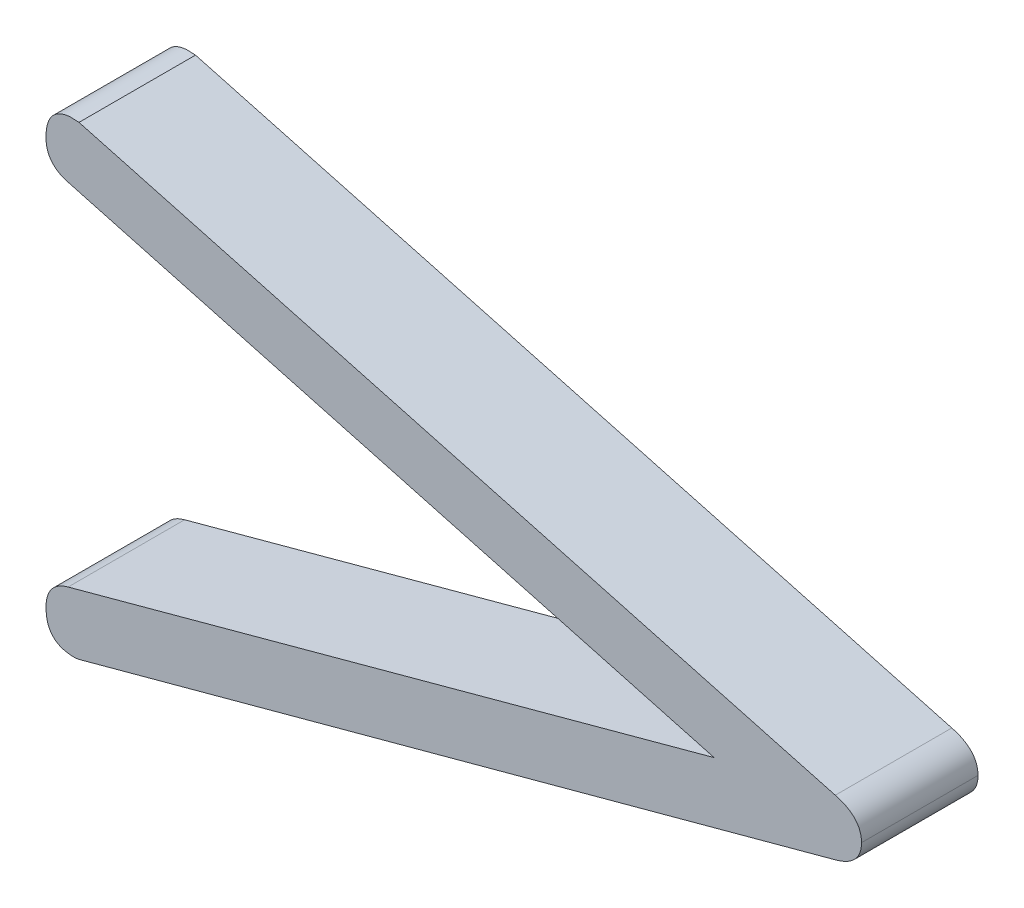
ISO-10303-21;
HEADER;
FILE_DESCRIPTION(('STEP AP214'),'2;1');
FILE_NAME('part.step','',(''),(''),'','','');
FILE_SCHEMA(('AUTOMOTIVE_DESIGN { 1 0 10303 214 1 1 1 1 }'));
ENDSEC;
DATA;
#1=APPLICATION_CONTEXT('core data for automotive mechanical design processes');
#2=APPLICATION_PROTOCOL_DEFINITION('international standard','automotive_design',2000,#1);
#3=PRODUCT_CONTEXT('',#1,'mechanical');
#4=PRODUCT('Part','Part','',(#3));
#5=PRODUCT_RELATED_PRODUCT_CATEGORY('part','',(#4));
#6=PRODUCT_DEFINITION_FORMATION('','',#4);
#7=PRODUCT_DEFINITION_CONTEXT('part definition',#1,'design');
#8=PRODUCT_DEFINITION('design','',#6,#7);
#9=PRODUCT_DEFINITION_SHAPE('','',#8);
#10=(LENGTH_UNIT() NAMED_UNIT(*) SI_UNIT(.MILLI.,.METRE.));
#11=(NAMED_UNIT(*) PLANE_ANGLE_UNIT() SI_UNIT($,.RADIAN.));
#12=(NAMED_UNIT(*) SI_UNIT($,.STERADIAN.) SOLID_ANGLE_UNIT());
#13=UNCERTAINTY_MEASURE_WITH_UNIT(LENGTH_MEASURE(1.E-05),#10,'distance_accuracy_value','');
#14=(GEOMETRIC_REPRESENTATION_CONTEXT(3) GLOBAL_UNCERTAINTY_ASSIGNED_CONTEXT((#13)) GLOBAL_UNIT_ASSIGNED_CONTEXT((#10,
#11,#12)) REPRESENTATION_CONTEXT('',''));
#15=CARTESIAN_POINT('',(0.,0.,0.));
#16=DIRECTION('',(0.,0.,1.));
#17=DIRECTION('',(1.,0.,0.));
#18=AXIS2_PLACEMENT_3D('',#15,#16,#17);
#19=CARTESIAN_POINT('',(0.,0.,0.));
#20=DIRECTION('',(0.,0.,1.));
#21=DIRECTION('',(1.,0.,0.));
#22=AXIS2_PLACEMENT_3D('',#19,#20,#21);
#23=PLANE('',#22);
#24=CARTESIAN_POINT('',(2.1,-20.0656,0.));
#25=CARTESIAN_POINT('',(2.10000970347079,-20.0677080574103,0.));
#26=CARTESIAN_POINT('',(2.10013333109448,-20.0698520839059,0.));
#27=CARTESIAN_POINT('',(2.10078602699821,-20.0741208006995,0.));
#28=CARTESIAN_POINT('',(2.10132413710864,-20.0762439757279,0.));
#29=CARTESIAN_POINT('',(2.10296639632321,-20.0801945954178,0.));
#30=CARTESIAN_POINT('',(2.10404789478391,-20.082030291777,0.));
#31=CARTESIAN_POINT('',(2.1068098801869,-20.0851993869252,0.));
#32=CARTESIAN_POINT('',(2.1084926835452,-20.0865308016229,0.));
#33=CARTESIAN_POINT('',(2.11258151284131,-20.0887938875692,0.));
#34=CARTESIAN_POINT('',(2.11506522809337,-20.0895751724411,0.));
#35=CARTESIAN_POINT('',(2.11937757013724,-20.0903719652707,0.));
#36=CARTESIAN_POINT('',(2.12118699150909,-20.0905439618704,0.));
#37=CARTESIAN_POINT('',(2.12388693848356,-20.0906286078763,0.));
#38=CARTESIAN_POINT('',(2.12477514003824,-20.0906288179088,0.));
#39=CARTESIAN_POINT('',(2.12655037575795,-20.0906211872641,0.));
#40=CARTESIAN_POINT('',(2.12743740987414,-20.0906133574946,0.));
#41=CARTESIAN_POINT('',(2.12832375,-20.090625,0.));
#42=B_SPLINE_CURVE_WITH_KNOTS('',3,(#24,#25,#26,#27,#28,#29,#30,#31,#32,#33,#34,#35,#36,#37,#38,
#39,#40,#41),.UNSPECIFIED.,.F.,.F.,(4,2,2,2,2,2,2,2,4),(0.,0.00637906803394492,
0.0129013779902544,0.0191719291895752,0.0254669016726035,0.0331339736282535,0.0385746638490226,
0.041238663694584,0.0438990540692049),.UNSPECIFIED.);
#43=CARTESIAN_POINT('',(2.1,-20.0656,0.));
#44=VERTEX_POINT('',#43);
#45=CARTESIAN_POINT('',(2.12832375,-20.09012625,0.));
#46=VERTEX_POINT('',#45);
#47=EDGE_CURVE('E148',#44,#46,#42,.T.);
#48=ORIENTED_EDGE('',*,*,#47,.T.);
#49=DIRECTION('',(0.965110852051681,0.261841637735633,0.));
#50=VECTOR('',#49,1.);
#51=CARTESIAN_POINT('',(2.1321475,-20.0896275,0.));
#52=LINE('',#51,#50);
#53=CARTESIAN_POINT('',(2.777495,-19.91454,0.));
#54=VERTEX_POINT('',#53);
#55=EDGE_CURVE('E97',#54,#46,#52,.F.);
#56=ORIENTED_EDGE('',*,*,#55,.F.);
#57=CARTESIAN_POINT('',(2.777495,-19.91454,0.));
#58=CARTESIAN_POINT('',(2.78156755087784,-19.9134856277711,0.));
#59=CARTESIAN_POINT('',(2.78585959234598,-19.9118743738558,0.));
#60=CARTESIAN_POINT('',(2.79169972044523,-19.9081124564617,0.));
#61=CARTESIAN_POINT('',(2.79363677986709,-19.9064861740352,0.));
#62=CARTESIAN_POINT('',(2.79603992557887,-19.9035901894174,0.));
#63=CARTESIAN_POINT('',(2.79675943821924,-19.9025426768256,0.));
#64=CARTESIAN_POINT('',(2.7979861762145,-19.9003249085204,0.));
#65=CARTESIAN_POINT('',(2.79849245872539,-19.8991541356921,0.));
#66=CARTESIAN_POINT('',(2.7992766594172,-19.896751876049,0.));
#67=CARTESIAN_POINT('',(2.79955654615001,-19.8955210134973,0.));
#68=CARTESIAN_POINT('',(2.79991893592626,-19.8930348663555,0.));
#69=CARTESIAN_POINT('',(2.80000223020693,-19.891779700234,0.));
#70=CARTESIAN_POINT('',(2.8,-19.89053,0.));
#71=B_SPLINE_CURVE_WITH_KNOTS('',3,(#57,#58,#59,#60,#61,#62,#63,#64,#65,#66,#67,#68,#69,#70),
.UNSPECIFIED.,.F.,.F.,(4,2,2,2,2,2,4),(0.,0.0130937867306449,0.0205946478589212,
0.0243812846568346,0.0281844934508419,0.0319542660278836,0.0357088401121008),.UNSPECIFIED.);
#72=CARTESIAN_POINT('',(2.8,-19.89053,0.));
#73=VERTEX_POINT('',#72);
#74=EDGE_CURVE('E133',#54,#73,#71,.T.);
#75=ORIENTED_EDGE('',*,*,#74,.T.);
#76=CARTESIAN_POINT('',(2.8,-19.89053,0.));
#77=CARTESIAN_POINT('',(2.79999889377567,-19.8892563216599,0.));
#78=CARTESIAN_POINT('',(2.79991434309367,-19.887978408454,0.));
#79=CARTESIAN_POINT('',(2.79954223659405,-19.8854496198036,0.));
#80=CARTESIAN_POINT('',(2.79925406158846,-19.8841988388513,0.));
#81=CARTESIAN_POINT('',(2.79802834340126,-19.8805471487768,0.));
#82=CARTESIAN_POINT('',(2.79672927916521,-19.8782530986676,0.));
#83=CARTESIAN_POINT('',(2.79360697717634,-19.8745606221918,0.));
#84=CARTESIAN_POINT('',(2.7918663142958,-19.8730873597134,0.));
#85=CARTESIAN_POINT('',(2.78660764476819,-19.8695769042191,0.));
#86=CARTESIAN_POINT('',(2.78278027780222,-19.8680287647667,0.));
#87=CARTESIAN_POINT('',(2.77842261509165,-19.8667559222682,0.));
#88=CARTESIAN_POINT('',(2.77795896584628,-19.8666265643913,0.));
#89=CARTESIAN_POINT('',(2.777495,-19.8665025,0.));
#90=B_SPLINE_CURVE_WITH_KNOTS('',3,(#76,#77,#78,#79,#80,#81,#82,#83,#84,#85,#86,#87,#88,#89),
.UNSPECIFIED.,.F.,.F.,(4,2,2,2,2,2,4),(0.,0.00382370389001658,0.00765908535030205,
0.0153473873779204,0.0221042106874685,0.0342563446680799,0.0356999344152531),.UNSPECIFIED.);
#91=CARTESIAN_POINT('',(2.777495,-19.8665025,0.));
#92=VERTEX_POINT('',#91);
#93=EDGE_CURVE('E24',#73,#92,#90,.T.);
#94=ORIENTED_EDGE('',*,*,#93,.T.);
#95=DIRECTION('',(-0.96511085205168,0.261841637735637,0.));
#96=VECTOR('',#95,1.);
#97=CARTESIAN_POINT('',(2.777495,-19.8665025,0.));
#98=LINE('',#97,#96);
#99=CARTESIAN_POINT('',(2.12832375,-19.6909075,0.));
#100=VERTEX_POINT('',#99);
#101=EDGE_CURVE('E165',#100,#92,#98,.F.);
#102=ORIENTED_EDGE('',*,*,#101,.F.);
#103=CARTESIAN_POINT('',(2.12832375,-19.6904,0.));
#104=CARTESIAN_POINT('',(2.12731809581263,-19.6904110772694,0.));
#105=CARTESIAN_POINT('',(2.12631163879908,-19.6904009482544,0.));
#106=CARTESIAN_POINT('',(2.12429500455522,-19.6903990480828,0.));
#107=CARTESIAN_POINT('',(2.12328482797132,-19.690407347987,0.));
#108=CARTESIAN_POINT('',(2.12021381161514,-19.6905543029241,0.));
#109=CARTESIAN_POINT('',(2.11815608492805,-19.6908198930804,0.));
#110=CARTESIAN_POINT('',(2.11395348249331,-19.6918495871112,0.));
#111=CARTESIAN_POINT('',(2.11181722505829,-19.6926560764791,0.));
#112=CARTESIAN_POINT('',(2.10794300387684,-19.6950063828776,0.));
#113=CARTESIAN_POINT('',(2.10620817691226,-19.6965557340514,0.));
#114=CARTESIAN_POINT('',(2.10360117797949,-19.6999746446029,0.));
#115=CARTESIAN_POINT('',(2.10265566296734,-19.7017909950377,0.));
#116=CARTESIAN_POINT('',(2.10075930750034,-19.7068552493374,0.));
#117=CARTESIAN_POINT('',(2.10022995500417,-19.7102464459817,0.));
#118=CARTESIAN_POINT('',(2.10002042558835,-19.7144720519002,0.));
#119=CARTESIAN_POINT('',(2.10000116680941,-19.7153182811497,0.));
#120=CARTESIAN_POINT('',(2.1,-19.71616,0.));
#121=B_SPLINE_CURVE_WITH_KNOTS('',3,(#103,#104,#105,#106,#107,#108,#109,#110,#111,#112,#113,
#114,#115,#116,#117,#118,#119,#120),.UNSPECIFIED.,.F.,.F.,(4,2,2,2,2,2,2,2,4),(0.,
0.00301848469965067,0.00604862868267463,0.0122393137992172,0.0189826372191156,
0.0257769963324072,0.0318318197587684,0.0419463219559924,0.0444820605668196),.UNSPECIFIED.);
#122=CARTESIAN_POINT('',(2.1,-19.71616,0.));
#123=VERTEX_POINT('',#122);
#124=EDGE_CURVE('E113',#100,#123,#121,.T.);
#125=ORIENTED_EDGE('',*,*,#124,.T.);
#126=CARTESIAN_POINT('',(2.1,-19.71616,0.));
#127=CARTESIAN_POINT('',(2.1000016046094,-19.7178355725978,0.));
#128=CARTESIAN_POINT('',(2.10011421040318,-19.7195246560967,0.));
#129=CARTESIAN_POINT('',(2.10064155492799,-19.7228694817666,0.));
#130=CARTESIAN_POINT('',(2.10105928652063,-19.7245247254618,0.));
#131=CARTESIAN_POINT('',(2.10249194620053,-19.7282569373218,0.));
#132=CARTESIAN_POINT('',(2.10366381039703,-19.7302809197306,0.));
#133=CARTESIAN_POINT('',(2.10662150355941,-19.733780451303,0.));
#134=CARTESIAN_POINT('',(2.10840703269673,-19.7352562675619,0.));
#135=CARTESIAN_POINT('',(2.11302731012879,-19.7381327151326,0.));
#136=CARTESIAN_POINT('',(2.11600843687273,-19.7393153232981,0.));
#137=CARTESIAN_POINT('',(2.11897,-19.740065,0.));
#138=B_SPLINE_CURVE_WITH_KNOTS('',3,(#126,#127,#128,#129,#130,#131,#132,#133,#134,#135,#136,
#137),.UNSPECIFIED.,.F.,.F.,(4,2,2,2,2,4),(0.,0.00504287618513377,0.0101358917776445,
0.0169963092321396,0.0238533795315011,0.0331771308776696),.UNSPECIFIED.);
#139=CARTESIAN_POINT('',(2.11897,-19.740065,0.));
#140=VERTEX_POINT('',#139);
#141=EDGE_CURVE('E163',#123,#140,#138,.T.);
#142=ORIENTED_EDGE('',*,*,#141,.T.);
#143=DIRECTION('',(0.965116461834926,-0.261820959999834,0.));
#144=VECTOR('',#143,1.);
#145=CARTESIAN_POINT('',(2.11897,-19.740065,0.));
#146=LINE('',#145,#144);
#147=CARTESIAN_POINT('',(2.673545,-19.8905125,0.));
#148=VERTEX_POINT('',#147);
#149=EDGE_CURVE('E160',#148,#140,#146,.F.);
#150=ORIENTED_EDGE('',*,*,#149,.F.);
#151=DIRECTION('',(-0.965106677675537,-0.26185702340416,0.));
#152=VECTOR('',#151,1.);
#153=CARTESIAN_POINT('',(2.673545,-19.8905125,0.));
#154=LINE('',#153,#152);
#155=CARTESIAN_POINT('',(2.1189875,-20.0409775,0.));
#156=VERTEX_POINT('',#155);
#157=EDGE_CURVE('E155',#156,#148,#154,.F.);
#158=ORIENTED_EDGE('',*,*,#157,.F.);
#159=CARTESIAN_POINT('',(2.1189875,-20.0409775,0.));
#160=CARTESIAN_POINT('',(2.11733899439622,-20.0414346701146,0.));
#161=CARTESIAN_POINT('',(2.11570580437241,-20.0419929684051,0.));
#162=CARTESIAN_POINT('',(2.11253461485492,-20.0433793428064,0.));
#163=CARTESIAN_POINT('',(2.11099820045475,-20.0442109635053,0.));
#164=CARTESIAN_POINT('',(2.10760759197941,-20.0465686981278,0.));
#165=CARTESIAN_POINT('',(2.10584444619983,-20.0482377564262,0.));
#166=CARTESIAN_POINT('',(2.10302312474797,-20.0520948192898,0.));
#167=CARTESIAN_POINT('',(2.10196591867292,-20.0542835320258,0.));
#168=CARTESIAN_POINT('',(2.10079782642278,-20.058033359217,0.));
#169=CARTESIAN_POINT('',(2.10048407853022,-20.0595407120235,0.));
#170=CARTESIAN_POINT('',(2.10008779521396,-20.0625677027371,0.));
#171=CARTESIAN_POINT('',(2.10000239119588,-20.0640869453895,0.));
#172=CARTESIAN_POINT('',(2.1,-20.0656,0.));
#173=B_SPLINE_CURVE_WITH_KNOTS('',3,(#159,#160,#161,#162,#163,#164,#165,#166,#167,#168,#169,
#170,#171,#172),.UNSPECIFIED.,.F.,.F.,(4,2,2,2,2,2,4),(0.,0.00514690530811887,
0.0103633814879542,0.0174990321108531,0.024644463389799,0.0292476731337171,0.0337927767257389),.UNSPECIFIED.);
#174=EDGE_CURVE('E149',#156,#44,#173,.T.);
#175=ORIENTED_EDGE('',*,*,#174,.T.);
#176=EDGE_LOOP('',(#48,#56,#75,#94,#102,#125,#142,#150,#158,#175));
#177=FACE_BOUND('',#176,.T.);
#178=ADVANCED_FACE('F17',(#177),#23,.T.);
#179=CARTESIAN_POINT('',(2.8,-19.89053,-0.1));
#180=CARTESIAN_POINT('',(2.8,-19.872505,-0.1));
#181=CARTESIAN_POINT('',(2.777495,-19.8665025,-0.1));
#182=CARTESIAN_POINT('',(2.8,-19.89053,0.));
#183=CARTESIAN_POINT('',(2.8,-19.872505,0.));
#184=CARTESIAN_POINT('',(2.777495,-19.8665025,0.));
#185=B_SPLINE_SURFACE_WITH_KNOTS('',1,2,((#179,#180,#181),(#182,#183,#184)),.UNSPECIFIED.,.F.,
.F.,.F.,(2,2),(3,3),(0.,1.),(0.,1.),.UNSPECIFIED.);
#186=DIRECTION('',(0.,0.,-1.));
#187=VECTOR('',#186,1.);
#188=CARTESIAN_POINT('',(2.8,-19.89053,-0.05));
#189=LINE('',#188,#187);
#190=CARTESIAN_POINT('',(2.8,-19.89053,-0.1));
#191=VERTEX_POINT('',#190);
#192=EDGE_CURVE('E141',#73,#191,#189,.T.);
#193=CARTESIAN_POINT('',(2.8,-19.89053,-0.1));
#194=CARTESIAN_POINT('',(2.79999889377567,-19.8892563216599,-0.1));
#195=CARTESIAN_POINT('',(2.79991434309367,-19.887978408454,-0.1));
#196=CARTESIAN_POINT('',(2.79954223659405,-19.8854496198036,-0.1));
#197=CARTESIAN_POINT('',(2.79925406158846,-19.8841988388513,-0.1));
#198=CARTESIAN_POINT('',(2.79802834340126,-19.8805471487768,-0.1));
#199=CARTESIAN_POINT('',(2.79672927916521,-19.8782530986676,-0.1));
#200=CARTESIAN_POINT('',(2.79360697717634,-19.8745606221918,-0.1));
#201=CARTESIAN_POINT('',(2.7918663142958,-19.8730873597134,-0.1));
#202=CARTESIAN_POINT('',(2.78660764476819,-19.8695769042191,-0.1));
#203=CARTESIAN_POINT('',(2.78278027780222,-19.8680287647667,-0.1));
#204=CARTESIAN_POINT('',(2.77842261509165,-19.8667559222682,-0.1));
#205=CARTESIAN_POINT('',(2.77795896584628,-19.8666265643913,-0.1));
#206=CARTESIAN_POINT('',(2.777495,-19.8665025,-0.1));
#207=B_SPLINE_CURVE_WITH_KNOTS('',3,(#193,#194,#195,#196,#197,#198,#199,#200,#201,#202,#203,
#204,#205,#206),.UNSPECIFIED.,.F.,.F.,(4,2,2,2,2,2,4),(0.,0.00382370389001661,
0.00765908535030198,0.0153473873779204,0.0221042106874685,0.0342563446680798,0.035699934415253),.UNSPECIFIED.);
#208=CARTESIAN_POINT('',(2.777495,-19.8665025,-0.1));
#209=VERTEX_POINT('',#208);
#210=EDGE_CURVE('E131',#191,#209,#207,.T.);
#211=DIRECTION('',(0.,0.,1.));
#212=VECTOR('',#211,1.);
#213=CARTESIAN_POINT('',(2.777495,-19.8665025,-0.1));
#214=LINE('',#213,#212);
#215=EDGE_CURVE('E117',#92,#209,#214,.F.);
#216=ORIENTED_EDGE('',*,*,#192,.T.);
#217=ORIENTED_EDGE('',*,*,#210,.T.);
#218=ORIENTED_EDGE('',*,*,#215,.F.);
#219=ORIENTED_EDGE('',*,*,#93,.F.);
#220=EDGE_LOOP('',(#216,#217,#218,#219));
#221=FACE_BOUND('',#220,.T.);
#222=ADVANCED_FACE('F251',(#221),#185,.F.);
#223=CARTESIAN_POINT('',(2.777495,-19.8665025,-0.1));
#224=DIRECTION('',(0.261841637735637,0.96511085205168,0.));
#225=DIRECTION('',(-0.96511085205168,0.261841637735637,0.));
#226=AXIS2_PLACEMENT_3D('',#223,#224,#225);
#227=PLANE('',#226);
#228=DIRECTION('',(-0.96511085205168,0.261841637735637,0.));
#229=VECTOR('',#228,1.);
#230=CARTESIAN_POINT('',(2.777495,-19.8665025,-0.1));
#231=LINE('',#230,#229);
#232=CARTESIAN_POINT('',(2.12832375,-19.6909075,-0.1));
#233=VERTEX_POINT('',#232);
#234=EDGE_CURVE('E124',#209,#233,#231,.T.);
#235=ORIENTED_EDGE('',*,*,#234,.T.);
#236=DIRECTION('',(0.,0.,1.));
#237=VECTOR('',#236,1.);
#238=CARTESIAN_POINT('',(2.12840635507246,-19.6904,-0.1));
#239=LINE('',#238,#237);
#240=EDGE_CURVE('E108',#233,#100,#239,.T.);
#241=ORIENTED_EDGE('',*,*,#240,.T.);
#242=ORIENTED_EDGE('',*,*,#101,.T.);
#243=ORIENTED_EDGE('',*,*,#215,.T.);
#244=EDGE_LOOP('',(#235,#241,#242,#243));
#245=FACE_BOUND('',#244,.T.);
#246=ADVANCED_FACE('F130',(#245),#227,.T.);
#247=CARTESIAN_POINT('',(2.1286406925,-19.6904,-0.1));
#248=CARTESIAN_POINT('',(2.12657034625,-19.6904,-0.1));
#249=CARTESIAN_POINT('',(2.1245,-19.6904,-0.1));
#250=CARTESIAN_POINT('',(2.1,-19.6904,-0.1));
#251=CARTESIAN_POINT('',(2.1,-19.71616,-0.1));
#252=CARTESIAN_POINT('',(2.1286406925,-19.6904,0.));
#253=CARTESIAN_POINT('',(2.12657034625,-19.6904,0.));
#254=CARTESIAN_POINT('',(2.1245,-19.6904,0.));
#255=CARTESIAN_POINT('',(2.1,-19.6904,0.));
#256=CARTESIAN_POINT('',(2.1,-19.71616,0.));
#257=B_SPLINE_SURFACE_WITH_KNOTS('',1,2,((#247,#248,#249,#250,#251),(#252,#253,#254,#255,#256)),
.UNSPECIFIED.,.F.,.F.,.F.,(2,2),(3,2,3),(0.,1.),(-0.0845039285714351,0.,1.),.UNSPECIFIED.);
#258=CARTESIAN_POINT('',(2.12832375,-19.6904,-0.1));
#259=CARTESIAN_POINT('',(2.12731809581263,-19.6904110772694,-0.1));
#260=CARTESIAN_POINT('',(2.12631163879907,-19.6904009482544,-0.1));
#261=CARTESIAN_POINT('',(2.12429500455521,-19.6903990480829,-0.1));
#262=CARTESIAN_POINT('',(2.12328482797131,-19.690407347987,-0.1));
#263=CARTESIAN_POINT('',(2.12021381161512,-19.6905543029241,-0.1));
#264=CARTESIAN_POINT('',(2.11815608492803,-19.6908198930804,-0.1));
#265=CARTESIAN_POINT('',(2.11395348249328,-19.6918495871112,-0.1));
#266=CARTESIAN_POINT('',(2.11181722505827,-19.6926560764791,-0.1));
#267=CARTESIAN_POINT('',(2.10794300387682,-19.6950063828776,-0.1));
#268=CARTESIAN_POINT('',(2.10620817691224,-19.6965557340514,-0.1));
#269=CARTESIAN_POINT('',(2.10360117797948,-19.6999746446029,-0.1));
#270=CARTESIAN_POINT('',(2.10265566296733,-19.7017909950377,-0.1));
#271=CARTESIAN_POINT('',(2.10075930750034,-19.7068552493374,-0.1));
#272=CARTESIAN_POINT('',(2.10022995500417,-19.7102464459817,-0.1));
#273=CARTESIAN_POINT('',(2.10002042558835,-19.7144720519002,-0.1));
#274=CARTESIAN_POINT('',(2.10000116680941,-19.7153182811497,-0.1));
#275=CARTESIAN_POINT('',(2.1,-19.71616,-0.1));
#276=B_SPLINE_CURVE_WITH_KNOTS('',3,(#258,#259,#260,#261,#262,#263,#264,#265,#266,#267,#268,
#269,#270,#271,#272,#273,#274,#275),.UNSPECIFIED.,.F.,.F.,(4,2,2,2,2,2,2,2,4),(0.,
0.00301848469965761,0.00604862868268987,0.0122393137992458,0.0189826372191383,
0.0257769963324215,0.0318318197587768,0.0419463219560136,0.0444820605668165),.UNSPECIFIED.);
#277=CARTESIAN_POINT('',(2.1,-19.71616,-0.1));
#278=VERTEX_POINT('',#277);
#279=EDGE_CURVE('E112',#233,#278,#276,.T.);
#280=DIRECTION('',(0.,0.,1.));
#281=VECTOR('',#280,1.);
#282=CARTESIAN_POINT('',(2.1,-19.71616,-0.05));
#283=LINE('',#282,#281);
#284=EDGE_CURVE('E161',#278,#123,#283,.T.);
#285=ORIENTED_EDGE('',*,*,#240,.F.);
#286=ORIENTED_EDGE('',*,*,#279,.T.);
#287=ORIENTED_EDGE('',*,*,#284,.T.);
#288=ORIENTED_EDGE('',*,*,#124,.F.);
#289=EDGE_LOOP('',(#285,#286,#287,#288));
#290=FACE_BOUND('',#289,.T.);
#291=ADVANCED_FACE('F110',(#290),#257,.F.);
#292=CARTESIAN_POINT('',(2.1,-19.71616,-0.1));
#293=CARTESIAN_POINT('',(2.1,-19.7349725,-0.1));
#294=CARTESIAN_POINT('',(2.11897,-19.740065,-0.1));
#295=CARTESIAN_POINT('',(2.1,-19.71616,0.));
#296=CARTESIAN_POINT('',(2.1,-19.7349725,0.));
#297=CARTESIAN_POINT('',(2.11897,-19.740065,0.));
#298=B_SPLINE_SURFACE_WITH_KNOTS('',1,2,((#292,#293,#294),(#295,#296,#297)),.UNSPECIFIED.,.F.,
.F.,.F.,(2,2),(3,3),(0.,1.),(0.,1.),.UNSPECIFIED.);
#299=CARTESIAN_POINT('',(2.1,-19.71616,-0.1));
#300=CARTESIAN_POINT('',(2.1000016046094,-19.7178355725978,-0.1));
#301=CARTESIAN_POINT('',(2.10011421040318,-19.7195246560967,-0.1));
#302=CARTESIAN_POINT('',(2.10064155492799,-19.7228694817666,-0.1));
#303=CARTESIAN_POINT('',(2.10105928652063,-19.7245247254618,-0.1));
#304=CARTESIAN_POINT('',(2.10249194620053,-19.7282569373218,-0.1));
#305=CARTESIAN_POINT('',(2.10366381039703,-19.7302809197306,-0.1));
#306=CARTESIAN_POINT('',(2.10662150355941,-19.733780451303,-0.1));
#307=CARTESIAN_POINT('',(2.10840703269673,-19.7352562675619,-0.1));
#308=CARTESIAN_POINT('',(2.11302731012879,-19.7381327151326,-0.1));
#309=CARTESIAN_POINT('',(2.11600843687273,-19.7393153232981,-0.1));
#310=CARTESIAN_POINT('',(2.11897,-19.740065,-0.1));
#311=B_SPLINE_CURVE_WITH_KNOTS('',3,(#299,#300,#301,#302,#303,#304,#305,#306,#307,#308,#309,
#310),.UNSPECIFIED.,.F.,.F.,(4,2,2,2,2,4),(0.,0.00504287618513377,0.0101358917776445,
0.0169963092321396,0.0238533795315011,0.0331771308776696),.UNSPECIFIED.);
#312=CARTESIAN_POINT('',(2.11897,-19.740065,-0.1));
#313=VERTEX_POINT('',#312);
#314=EDGE_CURVE('E128',#278,#313,#311,.T.);
#315=DIRECTION('',(0.,0.,1.));
#316=VECTOR('',#315,1.);
#317=CARTESIAN_POINT('',(2.11897,-19.740065,-0.1));
#318=LINE('',#317,#316);
#319=EDGE_CURVE('E158',#140,#313,#318,.F.);
#320=ORIENTED_EDGE('',*,*,#284,.F.);
#321=ORIENTED_EDGE('',*,*,#314,.T.);
#322=ORIENTED_EDGE('',*,*,#319,.F.);
#323=ORIENTED_EDGE('',*,*,#141,.F.);
#324=EDGE_LOOP('',(#320,#321,#322,#323));
#325=FACE_BOUND('',#324,.T.);
#326=ADVANCED_FACE('F216',(#325),#298,.F.);
#327=CARTESIAN_POINT('',(2.11897,-19.740065,-0.1));
#328=DIRECTION('',(-0.261820959999834,-0.965116461834926,0.));
#329=DIRECTION('',(0.965116461834926,-0.261820959999834,0.));
#330=AXIS2_PLACEMENT_3D('',#327,#328,#329);
#331=PLANE('',#330);
#332=DIRECTION('',(0.965116461834926,-0.261820959999834,0.));
#333=VECTOR('',#332,1.);
#334=CARTESIAN_POINT('',(2.11897,-19.740065,-0.1));
#335=LINE('',#334,#333);
#336=CARTESIAN_POINT('',(2.673545,-19.8905125,-0.1));
#337=VERTEX_POINT('',#336);
#338=EDGE_CURVE('E215',#313,#337,#335,.T.);
#339=ORIENTED_EDGE('',*,*,#338,.T.);
#340=DIRECTION('',(0.,0.,1.));
#341=VECTOR('',#340,1.);
#342=CARTESIAN_POINT('',(2.673545,-19.8905125,-0.1));
#343=LINE('',#342,#341);
#344=EDGE_CURVE('E153',#148,#337,#343,.F.);
#345=ORIENTED_EDGE('',*,*,#344,.F.);
#346=ORIENTED_EDGE('',*,*,#149,.T.);
#347=ORIENTED_EDGE('',*,*,#319,.T.);
#348=EDGE_LOOP('',(#339,#345,#346,#347));
#349=FACE_BOUND('',#348,.T.);
#350=ADVANCED_FACE('F221',(#349),#331,.T.);
#351=CARTESIAN_POINT('',(2.673545,-19.8905125,-0.1));
#352=DIRECTION('',(-0.26185702340416,0.965106677675537,0.));
#353=DIRECTION('',(-0.965106677675537,-0.26185702340416,0.));
#354=AXIS2_PLACEMENT_3D('',#351,#352,#353);
#355=PLANE('',#354);
#356=DIRECTION('',(-0.965106677675537,-0.261857023404159,0.));
#357=VECTOR('',#356,1.);
#358=CARTESIAN_POINT('',(2.673545,-19.8905125,-0.1));
#359=LINE('',#358,#357);
#360=CARTESIAN_POINT('',(2.1189875,-20.0409775,-0.1));
#361=VERTEX_POINT('',#360);
#362=EDGE_CURVE('E307',#337,#361,#359,.T.);
#363=ORIENTED_EDGE('',*,*,#362,.T.);
#364=DIRECTION('',(0.,0.,1.));
#365=VECTOR('',#364,1.);
#366=CARTESIAN_POINT('',(2.1189875,-20.0409775,-0.05));
#367=LINE('',#366,#365);
#368=EDGE_CURVE('E150',#361,#156,#367,.T.);
#369=ORIENTED_EDGE('',*,*,#368,.T.);
#370=ORIENTED_EDGE('',*,*,#157,.T.);
#371=ORIENTED_EDGE('',*,*,#344,.T.);
#372=EDGE_LOOP('',(#363,#369,#370,#371));
#373=FACE_BOUND('',#372,.T.);
#374=ADVANCED_FACE('F295',(#373),#355,.T.);
#375=CARTESIAN_POINT('',(2.1189875,-20.0409775,-0.1));
#376=CARTESIAN_POINT('',(2.1,-20.04621,-0.1));
#377=CARTESIAN_POINT('',(2.1,-20.0656,-0.1));
#378=CARTESIAN_POINT('',(2.1189875,-20.0409775,0.));
#379=CARTESIAN_POINT('',(2.1,-20.04621,0.));
#380=CARTESIAN_POINT('',(2.1,-20.0656,0.));
#381=B_SPLINE_SURFACE_WITH_KNOTS('',1,2,((#375,#376,#377),(#378,#379,#380)),.UNSPECIFIED.,.F.,
.F.,.F.,(2,2),(3,3),(0.,1.),(0.,1.),.UNSPECIFIED.);
#382=CARTESIAN_POINT('',(2.1189875,-20.0409775,-0.1));
#383=CARTESIAN_POINT('',(2.11733899439622,-20.0414346701146,-0.1));
#384=CARTESIAN_POINT('',(2.11570580437241,-20.0419929684051,-0.1));
#385=CARTESIAN_POINT('',(2.11253461485492,-20.0433793428064,-0.1));
#386=CARTESIAN_POINT('',(2.11099820045475,-20.0442109635053,-0.1));
#387=CARTESIAN_POINT('',(2.10760759197941,-20.0465686981278,-0.1));
#388=CARTESIAN_POINT('',(2.10584444619983,-20.0482377564262,-0.1));
#389=CARTESIAN_POINT('',(2.10302312474797,-20.0520948192898,-0.1));
#390=CARTESIAN_POINT('',(2.10196591867292,-20.0542835320258,-0.1));
#391=CARTESIAN_POINT('',(2.10079782642278,-20.058033359217,-0.1));
#392=CARTESIAN_POINT('',(2.10048407853022,-20.0595407120235,-0.1));
#393=CARTESIAN_POINT('',(2.10008779521396,-20.0625677027371,-0.1));
#394=CARTESIAN_POINT('',(2.10000239119588,-20.0640869453895,-0.1));
#395=CARTESIAN_POINT('',(2.1,-20.0656,-0.1));
#396=B_SPLINE_CURVE_WITH_KNOTS('',3,(#382,#383,#384,#385,#386,#387,#388,#389,#390,#391,#392,
#393,#394,#395),.UNSPECIFIED.,.F.,.F.,(4,2,2,2,2,2,4),(0.,0.0051469053081192,0.0103633814879536,
0.0174990321108525,0.0246444633897984,0.0292476731337165,0.0337927767257383),.UNSPECIFIED.);
#397=CARTESIAN_POINT('',(2.1,-20.0656,-0.1));
#398=VERTEX_POINT('',#397);
#399=EDGE_CURVE('E205',#361,#398,#396,.T.);
#400=DIRECTION('',(0.,0.,1.));
#401=VECTOR('',#400,1.);
#402=CARTESIAN_POINT('',(2.1,-20.0656,-0.05));
#403=LINE('',#402,#401);
#404=EDGE_CURVE('E145',#398,#44,#403,.T.);
#405=ORIENTED_EDGE('',*,*,#368,.F.);
#406=ORIENTED_EDGE('',*,*,#399,.T.);
#407=ORIENTED_EDGE('',*,*,#404,.T.);
#408=ORIENTED_EDGE('',*,*,#174,.F.);
#409=EDGE_LOOP('',(#405,#406,#407,#408));
#410=FACE_BOUND('',#409,.T.);
#411=ADVANCED_FACE('F226',(#410),#381,.F.);
#412=CARTESIAN_POINT('',(2.1,-20.0656,-0.1));
#413=CARTESIAN_POINT('',(2.1,-20.090625,-0.1));
#414=CARTESIAN_POINT('',(2.1245,-20.090625,-0.1));
#415=CARTESIAN_POINT('',(2.12657034625,-20.090625,-0.1));
#416=CARTESIAN_POINT('',(2.1286406925,-20.090625,-0.1));
#417=CARTESIAN_POINT('',(2.1,-20.0656,0.));
#418=CARTESIAN_POINT('',(2.1,-20.090625,0.));
#419=CARTESIAN_POINT('',(2.1245,-20.090625,0.));
#420=CARTESIAN_POINT('',(2.12657034625,-20.090625,0.));
#421=CARTESIAN_POINT('',(2.1286406925,-20.090625,0.));
#422=B_SPLINE_SURFACE_WITH_KNOTS('',1,2,((#412,#413,#414,#415,#416),(#417,#418,#419,#420,#421)),
.UNSPECIFIED.,.F.,.F.,.F.,(2,2),(3,2,3),(0.,1.),(0.,1.,1.08450392857142),.UNSPECIFIED.);
#423=CARTESIAN_POINT('',(2.1,-20.0656,-0.1));
#424=CARTESIAN_POINT('',(2.10000970347079,-20.0677080574103,-0.1));
#425=CARTESIAN_POINT('',(2.10013333109448,-20.0698520839059,-0.1));
#426=CARTESIAN_POINT('',(2.10078602699821,-20.0741208006995,-0.1));
#427=CARTESIAN_POINT('',(2.10132413710864,-20.0762439757279,-0.1));
#428=CARTESIAN_POINT('',(2.10296639632321,-20.0801945954178,-0.1));
#429=CARTESIAN_POINT('',(2.10404789478391,-20.082030291777,-0.1));
#430=CARTESIAN_POINT('',(2.1068098801869,-20.0851993869252,-0.1));
#431=CARTESIAN_POINT('',(2.1084926835452,-20.0865308016229,-0.1));
#432=CARTESIAN_POINT('',(2.11258151284131,-20.0887938875692,-0.1));
#433=CARTESIAN_POINT('',(2.11506522809337,-20.0895751724411,-0.1));
#434=CARTESIAN_POINT('',(2.11937757013724,-20.0903719652707,-0.1));
#435=CARTESIAN_POINT('',(2.12118699150909,-20.0905439618704,-0.1));
#436=CARTESIAN_POINT('',(2.12388693848356,-20.0906286078763,-0.1));
#437=CARTESIAN_POINT('',(2.12477514003824,-20.0906288179088,-0.1));
#438=CARTESIAN_POINT('',(2.12655037575795,-20.0906211872641,-0.1));
#439=CARTESIAN_POINT('',(2.12743740987414,-20.0906133574946,-0.1));
#440=CARTESIAN_POINT('',(2.12832375,-20.090625,-0.1));
#441=B_SPLINE_CURVE_WITH_KNOTS('',3,(#423,#424,#425,#426,#427,#428,#429,#430,#431,#432,#433,
#434,#435,#436,#437,#438,#439,#440),.UNSPECIFIED.,.F.,.F.,(4,2,2,2,2,2,2,2,4),(0.,
0.00637906803394492,0.0129013779902544,0.0191719291895752,0.0254669016726035,0.0331339736282535,
0.0385746638490218,0.0412386636945832,0.0438990540692036),.UNSPECIFIED.);
#442=CARTESIAN_POINT('',(2.12832375,-20.09012625,-0.1));
#443=VERTEX_POINT('',#442);
#444=EDGE_CURVE('E182',#398,#443,#441,.T.);
#445=DIRECTION('',(0.,0.,1.));
#446=VECTOR('',#445,1.);
#447=CARTESIAN_POINT('',(2.12847085757121,-20.090625,0.));
#448=LINE('',#447,#446);
#449=EDGE_CURVE('E143',#46,#443,#448,.F.);
#450=ORIENTED_EDGE('',*,*,#404,.F.);
#451=ORIENTED_EDGE('',*,*,#444,.T.);
#452=ORIENTED_EDGE('',*,*,#449,.F.);
#453=ORIENTED_EDGE('',*,*,#47,.F.);
#454=EDGE_LOOP('',(#450,#451,#452,#453));
#455=FACE_BOUND('',#454,.T.);
#456=ADVANCED_FACE('F278',(#455),#422,.F.);
#457=CARTESIAN_POINT('',(2.1321475,-20.0896275,-0.1));
#458=DIRECTION('',(0.261841637735633,-0.965110852051681,0.));
#459=DIRECTION('',(0.965110852051681,0.261841637735633,0.));
#460=AXIS2_PLACEMENT_3D('',#457,#458,#459);
#461=PLANE('',#460);
#462=DIRECTION('',(0.965110852051681,0.261841637735632,0.));
#463=VECTOR('',#462,1.);
#464=CARTESIAN_POINT('',(2.1321475,-20.0896275,-0.1));
#465=LINE('',#464,#463);
#466=CARTESIAN_POINT('',(2.777495,-19.91454,-0.1));
#467=VERTEX_POINT('',#466);
#468=EDGE_CURVE('E35',#443,#467,#465,.T.);
#469=ORIENTED_EDGE('',*,*,#468,.T.);
#470=DIRECTION('',(0.,0.,1.));
#471=VECTOR('',#470,1.);
#472=CARTESIAN_POINT('',(2.777495,-19.91454,-0.05));
#473=LINE('',#472,#471);
#474=EDGE_CURVE('E43',#467,#54,#473,.T.);
#475=ORIENTED_EDGE('',*,*,#474,.T.);
#476=ORIENTED_EDGE('',*,*,#55,.T.);
#477=ORIENTED_EDGE('',*,*,#449,.T.);
#478=EDGE_LOOP('',(#469,#475,#476,#477));
#479=FACE_BOUND('',#478,.T.);
#480=ADVANCED_FACE('F187',(#479),#461,.T.);
#481=CARTESIAN_POINT('',(2.777495,-19.91454,-0.1));
#482=CARTESIAN_POINT('',(2.8,-19.9085375,-0.1));
#483=CARTESIAN_POINT('',(2.8,-19.89053,-0.1));
#484=CARTESIAN_POINT('',(2.777495,-19.91454,0.));
#485=CARTESIAN_POINT('',(2.8,-19.9085375,0.));
#486=CARTESIAN_POINT('',(2.8,-19.89053,0.));
#487=B_SPLINE_SURFACE_WITH_KNOTS('',1,2,((#481,#482,#483),(#484,#485,#486)),.UNSPECIFIED.,.F.,
.F.,.F.,(2,2),(3,3),(0.,1.),(0.,1.),.UNSPECIFIED.);
#488=CARTESIAN_POINT('',(2.777495,-19.91454,-0.1));
#489=CARTESIAN_POINT('',(2.78156755087784,-19.9134856277711,-0.1));
#490=CARTESIAN_POINT('',(2.78585959234598,-19.9118743738558,-0.1));
#491=CARTESIAN_POINT('',(2.79169972044523,-19.9081124564617,-0.1));
#492=CARTESIAN_POINT('',(2.79363677986709,-19.9064861740352,-0.1));
#493=CARTESIAN_POINT('',(2.79603992557887,-19.9035901894174,-0.1));
#494=CARTESIAN_POINT('',(2.79675943821924,-19.9025426768256,-0.1));
#495=CARTESIAN_POINT('',(2.7979861762145,-19.9003249085204,-0.1));
#496=CARTESIAN_POINT('',(2.79849245872539,-19.8991541356921,-0.1));
#497=CARTESIAN_POINT('',(2.7992766594172,-19.896751876049,-0.1));
#498=CARTESIAN_POINT('',(2.79955654615001,-19.8955210134973,-0.1));
#499=CARTESIAN_POINT('',(2.79991893592626,-19.8930348663555,-0.1));
#500=CARTESIAN_POINT('',(2.80000223020693,-19.891779700234,-0.1));
#501=CARTESIAN_POINT('',(2.8,-19.89053,-0.1));
#502=B_SPLINE_CURVE_WITH_KNOTS('',3,(#488,#489,#490,#491,#492,#493,#494,#495,#496,#497,#498,
#499,#500,#501),.UNSPECIFIED.,.F.,.F.,(4,2,2,2,2,2,4),(0.,0.0130937867306449,0.0205946478589212,
0.0243812846568346,0.0281844934508419,0.0319542660278836,0.0357088401121008),.UNSPECIFIED.);
#503=EDGE_CURVE('E11',#467,#191,#502,.T.);
#504=ORIENTED_EDGE('',*,*,#474,.F.);
#505=ORIENTED_EDGE('',*,*,#503,.T.);
#506=ORIENTED_EDGE('',*,*,#192,.F.);
#507=ORIENTED_EDGE('',*,*,#74,.F.);
#508=EDGE_LOOP('',(#504,#505,#506,#507));
#509=FACE_BOUND('',#508,.T.);
#510=ADVANCED_FACE('F19',(#509),#487,.F.);
#511=CARTESIAN_POINT('',(0.,0.,-0.1));
#512=DIRECTION('',(0.,0.,1.));
#513=DIRECTION('',(1.,0.,0.));
#514=AXIS2_PLACEMENT_3D('',#511,#512,#513);
#515=PLANE('',#514);
#516=ORIENTED_EDGE('',*,*,#468,.F.);
#517=ORIENTED_EDGE('',*,*,#444,.F.);
#518=ORIENTED_EDGE('',*,*,#399,.F.);
#519=ORIENTED_EDGE('',*,*,#362,.F.);
#520=ORIENTED_EDGE('',*,*,#338,.F.);
#521=ORIENTED_EDGE('',*,*,#314,.F.);
#522=ORIENTED_EDGE('',*,*,#279,.F.);
#523=ORIENTED_EDGE('',*,*,#234,.F.);
#524=ORIENTED_EDGE('',*,*,#210,.F.);
#525=ORIENTED_EDGE('',*,*,#503,.F.);
#526=EDGE_LOOP('',(#516,#517,#518,#519,#520,#521,#522,#523,#524,#525));
#527=FACE_BOUND('',#526,.T.);
#528=ADVANCED_FACE('F123',(#527),#515,.F.);
#529=CLOSED_SHELL('',(#178,#222,#246,#291,#326,#350,#374,#411,#456,#480,#510,#528));
#530=MANIFOLD_SOLID_BREP('B1',#529);
#531=ADVANCED_BREP_SHAPE_REPRESENTATION('',(#18,#530),#14);
#532=SHAPE_DEFINITION_REPRESENTATION(#9,#531);
ENDSEC;
END-ISO-10303-21;
